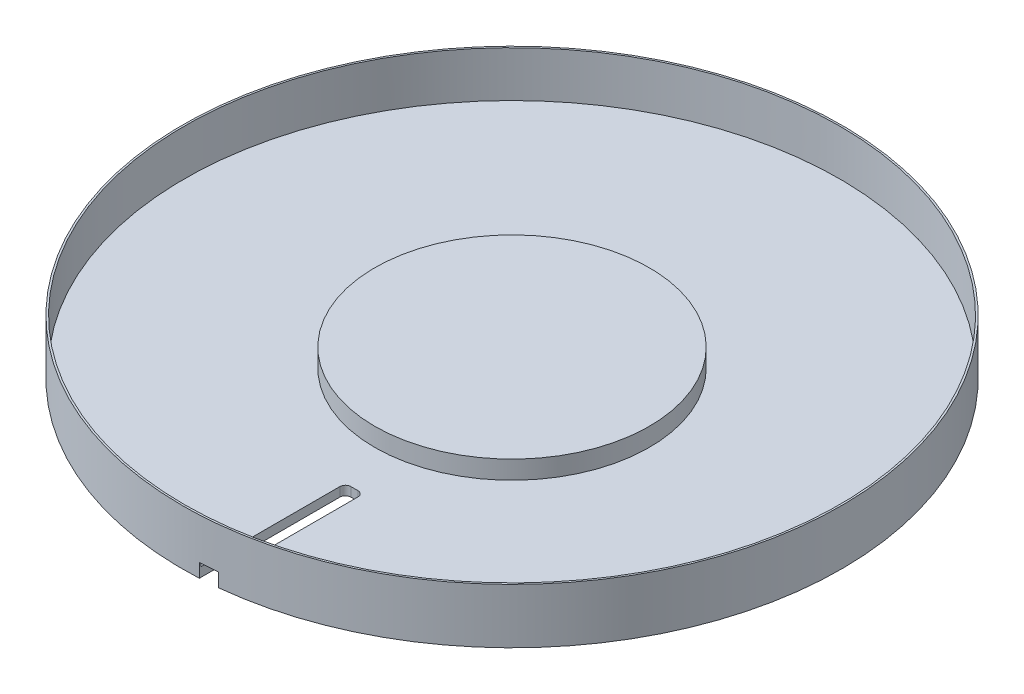
ISO-10303-21;
HEADER;
FILE_DESCRIPTION(('STEP AP214'),'2;1');
FILE_NAME('part.step','',(''),(''),'','','');
FILE_SCHEMA(('AUTOMOTIVE_DESIGN { 1 0 10303 214 1 1 1 1 }'));
ENDSEC;
DATA;
#1=APPLICATION_CONTEXT('core data for automotive mechanical design processes');
#2=APPLICATION_PROTOCOL_DEFINITION('international standard','automotive_design',2000,#1);
#3=PRODUCT_CONTEXT('',#1,'mechanical');
#4=PRODUCT('Part','Part','',(#3));
#5=PRODUCT_RELATED_PRODUCT_CATEGORY('part','',(#4));
#6=PRODUCT_DEFINITION_FORMATION('','',#4);
#7=PRODUCT_DEFINITION_CONTEXT('part definition',#1,'design');
#8=PRODUCT_DEFINITION('design','',#6,#7);
#9=PRODUCT_DEFINITION_SHAPE('','',#8);
#10=(LENGTH_UNIT() NAMED_UNIT(*) SI_UNIT(.MILLI.,.METRE.));
#11=(NAMED_UNIT(*) PLANE_ANGLE_UNIT() SI_UNIT($,.RADIAN.));
#12=(NAMED_UNIT(*) SI_UNIT($,.STERADIAN.) SOLID_ANGLE_UNIT());
#13=UNCERTAINTY_MEASURE_WITH_UNIT(LENGTH_MEASURE(1.E-05),#10,'distance_accuracy_value','');
#14=(GEOMETRIC_REPRESENTATION_CONTEXT(3) GLOBAL_UNCERTAINTY_ASSIGNED_CONTEXT((#13)) GLOBAL_UNIT_ASSIGNED_CONTEXT((#10,
#11,#12)) REPRESENTATION_CONTEXT('',''));
#15=CARTESIAN_POINT('',(0.,0.,0.));
#16=DIRECTION('',(0.,0.,1.));
#17=DIRECTION('',(1.,0.,0.));
#18=AXIS2_PLACEMENT_3D('',#15,#16,#17);
#19=CARTESIAN_POINT('',(0.,60.,0.));
#20=DIRECTION('',(0.,-1.,0.));
#21=DIRECTION('',(0.,0.,-1.));
#22=AXIS2_PLACEMENT_3D('',#19,#20,#21);
#23=CYLINDRICAL_SURFACE('',#22,360.);
#24=CARTESIAN_POINT('',(0.,60.,0.));
#25=DIRECTION('',(0.,1.,0.));
#26=DIRECTION('',(0.,0.,1.));
#27=AXIS2_PLACEMENT_3D('',#24,#25,#26);
#28=CIRCLE('',#27,360.);
#29=CARTESIAN_POINT('',(0.,60.,360.));
#30=VERTEX_POINT('',#29);
#31=EDGE_CURVE('E123',#30,#30,#28,.T.);
#32=ORIENTED_EDGE('',*,*,#31,.F.);
#33=EDGE_LOOP('',(#32));
#34=FACE_BOUND('',#33,.T.);
#35=CARTESIAN_POINT('',(0.,0.,0.));
#36=DIRECTION('',(0.,1.,0.));
#37=DIRECTION('',(0.,0.,1.));
#38=AXIS2_PLACEMENT_3D('',#35,#36,#37);
#39=CIRCLE('',#38,360.);
#40=CARTESIAN_POINT('',(37.673543,0.,358.023329069248));
#41=VERTEX_POINT('',#40);
#42=CARTESIAN_POINT('',(18.,0.,359.549718397887));
#43=VERTEX_POINT('',#42);
#44=EDGE_CURVE('E116',#41,#43,#39,.T.);
#45=ORIENTED_EDGE('',*,*,#44,.T.);
#46=DIRECTION('',(0.,-1.,0.));
#47=VECTOR('',#46,1.);
#48=CARTESIAN_POINT('',(18.,60.,359.549718397887));
#49=LINE('',#48,#47);
#50=CARTESIAN_POINT('',(18.,15.,359.549718397887));
#51=VERTEX_POINT('',#50);
#52=EDGE_CURVE('E183',#43,#51,#49,.F.);
#53=ORIENTED_EDGE('',*,*,#52,.T.);
#54=CARTESIAN_POINT('',(0.,15.,0.));
#55=DIRECTION('',(0.,1.,0.));
#56=DIRECTION('',(0.,0.,1.));
#57=AXIS2_PLACEMENT_3D('',#54,#55,#56);
#58=CIRCLE('',#57,360.);
#59=CARTESIAN_POINT('',(37.673543,15.,358.023329069248));
#60=VERTEX_POINT('',#59);
#61=EDGE_CURVE('E117',#51,#60,#58,.T.);
#62=ORIENTED_EDGE('',*,*,#61,.T.);
#63=DIRECTION('',(0.,-1.,0.));
#64=VECTOR('',#63,1.);
#65=CARTESIAN_POINT('',(37.673543,60.,358.023329069248));
#66=LINE('',#65,#64);
#67=EDGE_CURVE('E103',#60,#41,#66,.T.);
#68=ORIENTED_EDGE('',*,*,#67,.T.);
#69=EDGE_LOOP('',(#45,#53,#62,#68));
#70=FACE_BOUND('',#69,.T.);
#71=ADVANCED_FACE('F36',(#34,#70),#23,.T.);
#72=CARTESIAN_POINT('',(0.,60.,0.));
#73=DIRECTION('',(0.,1.,0.));
#74=DIRECTION('',(0.,0.,1.));
#75=AXIS2_PLACEMENT_3D('',#72,#73,#74);
#76=PLANE('',#75);
#77=CARTESIAN_POINT('',(0.,60.,0.));
#78=DIRECTION('',(0.,1.,0.));
#79=DIRECTION('',(0.,0.,1.));
#80=AXIS2_PLACEMENT_3D('',#77,#78,#79);
#81=CIRCLE('',#80,358.);
#82=CARTESIAN_POINT('',(0.,60.,358.));
#83=VERTEX_POINT('',#82);
#84=EDGE_CURVE('E146',#83,#83,#81,.T.);
#85=ORIENTED_EDGE('',*,*,#84,.F.);
#86=EDGE_LOOP('',(#85));
#87=FACE_BOUND('',#86,.T.);
#88=ORIENTED_EDGE('',*,*,#31,.T.);
#89=EDGE_LOOP('',(#88));
#90=FACE_BOUND('',#89,.T.);
#91=ADVANCED_FACE('F192',(#87,#90),#76,.T.);
#92=CARTESIAN_POINT('',(0.,0.,0.));
#93=DIRECTION('',(0.,1.,0.));
#94=DIRECTION('',(0.,0.,1.));
#95=AXIS2_PLACEMENT_3D('',#92,#93,#94);
#96=PLANE('',#95);
#97=DIRECTION('',(1.,0.,0.));
#98=VECTOR('',#97,1.);
#99=CARTESIAN_POINT('',(18.,0.,200.));
#100=LINE('',#99,#98);
#101=CARTESIAN_POINT('',(24.,0.,200.));
#102=VERTEX_POINT('',#101);
#103=CARTESIAN_POINT('',(31.673543,0.,200.));
#104=VERTEX_POINT('',#103);
#105=EDGE_CURVE('E158',#102,#104,#100,.T.);
#106=ORIENTED_EDGE('',*,*,#105,.F.);
#107=CARTESIAN_POINT('',(24.,0.,206.));
#108=DIRECTION('',(0.,1.,0.));
#109=DIRECTION('',(0.,0.,1.));
#110=AXIS2_PLACEMENT_3D('',#107,#108,#109);
#111=CIRCLE('',#110,6.);
#112=CARTESIAN_POINT('',(18.,0.,206.));
#113=VERTEX_POINT('',#112);
#114=EDGE_CURVE('E44',#102,#113,#111,.T.);
#115=ORIENTED_EDGE('',*,*,#114,.T.);
#116=DIRECTION('',(0.,0.,1.));
#117=VECTOR('',#116,1.);
#118=CARTESIAN_POINT('',(18.,0.,200.));
#119=LINE('',#118,#117);
#120=EDGE_CURVE('E110',#113,#43,#119,.T.);
#121=ORIENTED_EDGE('',*,*,#120,.T.);
#122=ORIENTED_EDGE('',*,*,#44,.F.);
#123=DIRECTION('',(0.,0.,1.));
#124=VECTOR('',#123,1.);
#125=CARTESIAN_POINT('',(37.673543,0.,200.));
#126=LINE('',#125,#124);
#127=CARTESIAN_POINT('',(37.673543,0.,206.));
#128=VERTEX_POINT('',#127);
#129=EDGE_CURVE('E98',#128,#41,#126,.T.);
#130=ORIENTED_EDGE('',*,*,#129,.F.);
#131=CARTESIAN_POINT('',(31.673543,0.,206.));
#132=DIRECTION('',(0.,1.,0.));
#133=DIRECTION('',(0.,0.,1.));
#134=AXIS2_PLACEMENT_3D('',#131,#132,#133);
#135=CIRCLE('',#134,6.);
#136=EDGE_CURVE('E156',#128,#104,#135,.T.);
#137=ORIENTED_EDGE('',*,*,#136,.T.);
#138=EDGE_LOOP('',(#106,#115,#121,#122,#130,#137));
#139=FACE_BOUND('',#138,.T.);
#140=ADVANCED_FACE('F121',(#139),#96,.F.);
#141=CARTESIAN_POINT('',(0.,-1012.57691065914,0.));
#142=DIRECTION('',(0.,1.,0.));
#143=DIRECTION('',(0.,0.,1.));
#144=AXIS2_PLACEMENT_3D('',#141,#142,#143);
#145=CYLINDRICAL_SURFACE('',#144,358.);
#146=CARTESIAN_POINT('',(0.,14.9999999999999,0.));
#147=DIRECTION('',(0.,1.,0.));
#148=DIRECTION('',(0.,0.,1.));
#149=AXIS2_PLACEMENT_3D('',#146,#147,#148);
#150=CIRCLE('',#149,358.);
#151=CARTESIAN_POINT('',(37.673543,15.,356.012224730875));
#152=VERTEX_POINT('',#151);
#153=CARTESIAN_POINT('',(18.,14.9999999999999,357.547199681385));
#154=VERTEX_POINT('',#153);
#155=EDGE_CURVE('E139',#152,#154,#150,.F.);
#156=ORIENTED_EDGE('',*,*,#155,.T.);
#157=DIRECTION('',(0.,1.,0.));
#158=VECTOR('',#157,1.);
#159=CARTESIAN_POINT('',(18.,-1012.57691065914,357.547199681385));
#160=LINE('',#159,#158);
#161=CARTESIAN_POINT('',(18.,10.,357.547199681385));
#162=VERTEX_POINT('',#161);
#163=EDGE_CURVE('E118',#154,#162,#160,.F.);
#164=ORIENTED_EDGE('',*,*,#163,.T.);
#165=CARTESIAN_POINT('',(0.,10.,0.));
#166=DIRECTION('',(0.,1.,0.));
#167=DIRECTION('',(0.,0.,1.));
#168=AXIS2_PLACEMENT_3D('',#165,#166,#167);
#169=CIRCLE('',#168,358.);
#170=CARTESIAN_POINT('',(37.673543,10.,356.012224730875));
#171=VERTEX_POINT('',#170);
#172=EDGE_CURVE('E130',#162,#171,#169,.F.);
#173=ORIENTED_EDGE('',*,*,#172,.T.);
#174=DIRECTION('',(0.,1.,0.));
#175=VECTOR('',#174,1.);
#176=CARTESIAN_POINT('',(37.673543,-1012.57691065914,356.012224730875));
#177=LINE('',#176,#175);
#178=EDGE_CURVE('E119',#171,#152,#177,.T.);
#179=ORIENTED_EDGE('',*,*,#178,.T.);
#180=EDGE_LOOP('',(#156,#164,#173,#179));
#181=FACE_BOUND('',#180,.T.);
#182=ORIENTED_EDGE('',*,*,#84,.T.);
#183=EDGE_LOOP('',(#182));
#184=FACE_BOUND('',#183,.T.);
#185=ADVANCED_FACE('F190',(#181,#184),#145,.F.);
#186=CARTESIAN_POINT('',(0.,-1012.57691065914,0.));
#187=DIRECTION('',(0.,1.,0.));
#188=DIRECTION('',(0.,0.,1.));
#189=AXIS2_PLACEMENT_3D('',#186,#187,#188);
#190=CYLINDRICAL_SURFACE('',#189,150.);
#191=CARTESIAN_POINT('',(0.,10.,0.));
#192=DIRECTION('',(0.,1.,0.));
#193=DIRECTION('',(0.,0.,1.));
#194=AXIS2_PLACEMENT_3D('',#191,#192,#193);
#195=CIRCLE('',#194,150.);
#196=CARTESIAN_POINT('',(0.,10.,150.));
#197=VERTEX_POINT('',#196);
#198=EDGE_CURVE('E124',#197,#197,#195,.F.);
#199=ORIENTED_EDGE('',*,*,#198,.F.);
#200=EDGE_LOOP('',(#199));
#201=FACE_BOUND('',#200,.T.);
#202=CARTESIAN_POINT('',(0.,30.,0.));
#203=DIRECTION('',(0.,1.,0.));
#204=DIRECTION('',(0.,0.,1.));
#205=AXIS2_PLACEMENT_3D('',#202,#203,#204);
#206=CIRCLE('',#205,150.);
#207=CARTESIAN_POINT('',(0.,30.,150.));
#208=VERTEX_POINT('',#207);
#209=EDGE_CURVE('E143',#208,#208,#206,.T.);
#210=ORIENTED_EDGE('',*,*,#209,.F.);
#211=EDGE_LOOP('',(#210));
#212=FACE_BOUND('',#211,.T.);
#213=ADVANCED_FACE('F228',(#201,#212),#190,.T.);
#214=CARTESIAN_POINT('',(0.,10.,0.));
#215=DIRECTION('',(0.,1.,0.));
#216=DIRECTION('',(0.,0.,1.));
#217=AXIS2_PLACEMENT_3D('',#214,#215,#216);
#218=PLANE('',#217);
#219=DIRECTION('',(0.,0.,1.));
#220=VECTOR('',#219,1.);
#221=CARTESIAN_POINT('',(18.,10.,0.));
#222=LINE('',#221,#220);
#223=CARTESIAN_POINT('',(18.,10.,206.));
#224=VERTEX_POINT('',#223);
#225=EDGE_CURVE('E137',#224,#162,#222,.T.);
#226=ORIENTED_EDGE('',*,*,#225,.F.);
#227=CARTESIAN_POINT('',(24.,10.,206.));
#228=DIRECTION('',(0.,1.,0.));
#229=DIRECTION('',(0.,0.,1.));
#230=AXIS2_PLACEMENT_3D('',#227,#228,#229);
#231=CIRCLE('',#230,6.);
#232=CARTESIAN_POINT('',(24.,10.,200.));
#233=VERTEX_POINT('',#232);
#234=EDGE_CURVE('E13',#224,#233,#231,.F.);
#235=ORIENTED_EDGE('',*,*,#234,.T.);
#236=DIRECTION('',(-1.,0.,0.));
#237=VECTOR('',#236,1.);
#238=CARTESIAN_POINT('',(0.,10.,200.));
#239=LINE('',#238,#237);
#240=CARTESIAN_POINT('',(31.673543,10.,200.));
#241=VERTEX_POINT('',#240);
#242=EDGE_CURVE('E127',#241,#233,#239,.T.);
#243=ORIENTED_EDGE('',*,*,#242,.F.);
#244=CARTESIAN_POINT('',(31.673543,10.,206.));
#245=DIRECTION('',(0.,1.,0.));
#246=DIRECTION('',(0.,0.,1.));
#247=AXIS2_PLACEMENT_3D('',#244,#245,#246);
#248=CIRCLE('',#247,6.);
#249=CARTESIAN_POINT('',(37.673543,10.,206.));
#250=VERTEX_POINT('',#249);
#251=EDGE_CURVE('E154',#241,#250,#248,.F.);
#252=ORIENTED_EDGE('',*,*,#251,.T.);
#253=DIRECTION('',(0.,0.,-1.));
#254=VECTOR('',#253,1.);
#255=CARTESIAN_POINT('',(37.673543,10.,0.));
#256=LINE('',#255,#254);
#257=EDGE_CURVE('E135',#171,#250,#256,.T.);
#258=ORIENTED_EDGE('',*,*,#257,.F.);
#259=ORIENTED_EDGE('',*,*,#172,.F.);
#260=EDGE_LOOP('',(#226,#235,#243,#252,#258,#259));
#261=FACE_BOUND('',#260,.T.);
#262=ORIENTED_EDGE('',*,*,#198,.T.);
#263=EDGE_LOOP('',(#262));
#264=FACE_BOUND('',#263,.T.);
#265=ADVANCED_FACE('F169',(#261,#264),#218,.T.);
#266=CARTESIAN_POINT('',(0.,30.,0.));
#267=DIRECTION('',(0.,1.,0.));
#268=DIRECTION('',(0.,0.,1.));
#269=AXIS2_PLACEMENT_3D('',#266,#267,#268);
#270=PLANE('',#269);
#271=ORIENTED_EDGE('',*,*,#209,.T.);
#272=EDGE_LOOP('',(#271));
#273=FACE_BOUND('',#272,.T.);
#274=ADVANCED_FACE('F204',(#273),#270,.T.);
#275=CARTESIAN_POINT('',(18.,15.,200.));
#276=DIRECTION('',(0.,1.,0.));
#277=DIRECTION('',(0.,0.,1.));
#278=AXIS2_PLACEMENT_3D('',#275,#276,#277);
#279=PLANE('',#278);
#280=DIRECTION('',(0.,0.,1.));
#281=VECTOR('',#280,1.);
#282=CARTESIAN_POINT('',(18.,15.,200.));
#283=LINE('',#282,#281);
#284=EDGE_CURVE('E175',#154,#51,#283,.T.);
#285=ORIENTED_EDGE('',*,*,#284,.F.);
#286=ORIENTED_EDGE('',*,*,#155,.F.);
#287=DIRECTION('',(0.,0.,1.));
#288=VECTOR('',#287,1.);
#289=CARTESIAN_POINT('',(37.673543,15.,200.));
#290=LINE('',#289,#288);
#291=EDGE_CURVE('E109',#152,#60,#290,.T.);
#292=ORIENTED_EDGE('',*,*,#291,.T.);
#293=ORIENTED_EDGE('',*,*,#61,.F.);
#294=EDGE_LOOP('',(#285,#286,#292,#293));
#295=FACE_BOUND('',#294,.T.);
#296=ADVANCED_FACE('F206',(#295),#279,.F.);
#297=CARTESIAN_POINT('',(18.,0.,200.));
#298=DIRECTION('',(-1.,0.,0.));
#299=DIRECTION('',(0.,0.,1.));
#300=AXIS2_PLACEMENT_3D('',#297,#298,#299);
#301=PLANE('',#300);
#302=ORIENTED_EDGE('',*,*,#120,.F.);
#303=DIRECTION('',(0.,-1.,0.));
#304=VECTOR('',#303,1.);
#305=CARTESIAN_POINT('',(18.,10.,206.));
#306=LINE('',#305,#304);
#307=EDGE_CURVE('E51',#113,#224,#306,.F.);
#308=ORIENTED_EDGE('',*,*,#307,.T.);
#309=ORIENTED_EDGE('',*,*,#225,.T.);
#310=ORIENTED_EDGE('',*,*,#163,.F.);
#311=ORIENTED_EDGE('',*,*,#284,.T.);
#312=ORIENTED_EDGE('',*,*,#52,.F.);
#313=EDGE_LOOP('',(#302,#308,#309,#310,#311,#312));
#314=FACE_BOUND('',#313,.T.);
#315=ADVANCED_FACE('F218',(#314),#301,.F.);
#316=CARTESIAN_POINT('',(37.673543,0.,200.));
#317=DIRECTION('',(1.,0.,0.));
#318=DIRECTION('',(0.,0.,-1.));
#319=AXIS2_PLACEMENT_3D('',#316,#317,#318);
#320=PLANE('',#319);
#321=ORIENTED_EDGE('',*,*,#257,.T.);
#322=DIRECTION('',(0.,1.,0.));
#323=VECTOR('',#322,1.);
#324=CARTESIAN_POINT('',(37.673543,0.,206.));
#325=LINE('',#324,#323);
#326=EDGE_CURVE('E106',#250,#128,#325,.F.);
#327=ORIENTED_EDGE('',*,*,#326,.T.);
#328=ORIENTED_EDGE('',*,*,#129,.T.);
#329=ORIENTED_EDGE('',*,*,#67,.F.);
#330=ORIENTED_EDGE('',*,*,#291,.F.);
#331=ORIENTED_EDGE('',*,*,#178,.F.);
#332=EDGE_LOOP('',(#321,#327,#328,#329,#330,#331));
#333=FACE_BOUND('',#332,.T.);
#334=ADVANCED_FACE('F101',(#333),#320,.F.);
#335=CARTESIAN_POINT('',(0.,0.,200.));
#336=DIRECTION('',(0.,0.,-1.));
#337=DIRECTION('',(-1.,0.,0.));
#338=AXIS2_PLACEMENT_3D('',#335,#336,#337);
#339=PLANE('',#338);
#340=ORIENTED_EDGE('',*,*,#105,.T.);
#341=DIRECTION('',(0.,1.,0.));
#342=VECTOR('',#341,1.);
#343=CARTESIAN_POINT('',(31.673543,10.,200.));
#344=LINE('',#343,#342);
#345=EDGE_CURVE('E149',#104,#241,#344,.T.);
#346=ORIENTED_EDGE('',*,*,#345,.T.);
#347=ORIENTED_EDGE('',*,*,#242,.T.);
#348=DIRECTION('',(0.,-1.,0.));
#349=VECTOR('',#348,1.);
#350=CARTESIAN_POINT('',(24.,0.,200.));
#351=LINE('',#350,#349);
#352=EDGE_CURVE('E142',#233,#102,#351,.T.);
#353=ORIENTED_EDGE('',*,*,#352,.T.);
#354=EDGE_LOOP('',(#340,#346,#347,#353));
#355=FACE_BOUND('',#354,.T.);
#356=ADVANCED_FACE('F162',(#355),#339,.F.);
#357=CARTESIAN_POINT('',(31.673543,0.,206.));
#358=DIRECTION('',(0.,-1.,0.));
#359=DIRECTION('',(0.,0.,-1.));
#360=AXIS2_PLACEMENT_3D('',#357,#358,#359);
#361=CYLINDRICAL_SURFACE('',#360,6.);
#362=ORIENTED_EDGE('',*,*,#136,.F.);
#363=ORIENTED_EDGE('',*,*,#326,.F.);
#364=ORIENTED_EDGE('',*,*,#251,.F.);
#365=ORIENTED_EDGE('',*,*,#345,.F.);
#366=EDGE_LOOP('',(#362,#363,#364,#365));
#367=FACE_BOUND('',#366,.T.);
#368=ADVANCED_FACE('F166',(#367),#361,.F.);
#369=CARTESIAN_POINT('',(24.,0.,206.));
#370=DIRECTION('',(0.,1.,0.));
#371=DIRECTION('',(0.,0.,1.));
#372=AXIS2_PLACEMENT_3D('',#369,#370,#371);
#373=CYLINDRICAL_SURFACE('',#372,6.);
#374=ORIENTED_EDGE('',*,*,#234,.F.);
#375=ORIENTED_EDGE('',*,*,#307,.F.);
#376=ORIENTED_EDGE('',*,*,#114,.F.);
#377=ORIENTED_EDGE('',*,*,#352,.F.);
#378=EDGE_LOOP('',(#374,#375,#376,#377));
#379=FACE_BOUND('',#378,.T.);
#380=ADVANCED_FACE('F38',(#379),#373,.F.);
#381=CLOSED_SHELL('',(#71,#91,#140,#185,#213,#265,#274,#296,#315,#334,#356,#368,#380));
#382=MANIFOLD_SOLID_BREP('B2',#381);
#383=ADVANCED_BREP_SHAPE_REPRESENTATION('',(#18,#382),#14);
#384=SHAPE_DEFINITION_REPRESENTATION(#9,#383);
ENDSEC;
END-ISO-10303-21;
